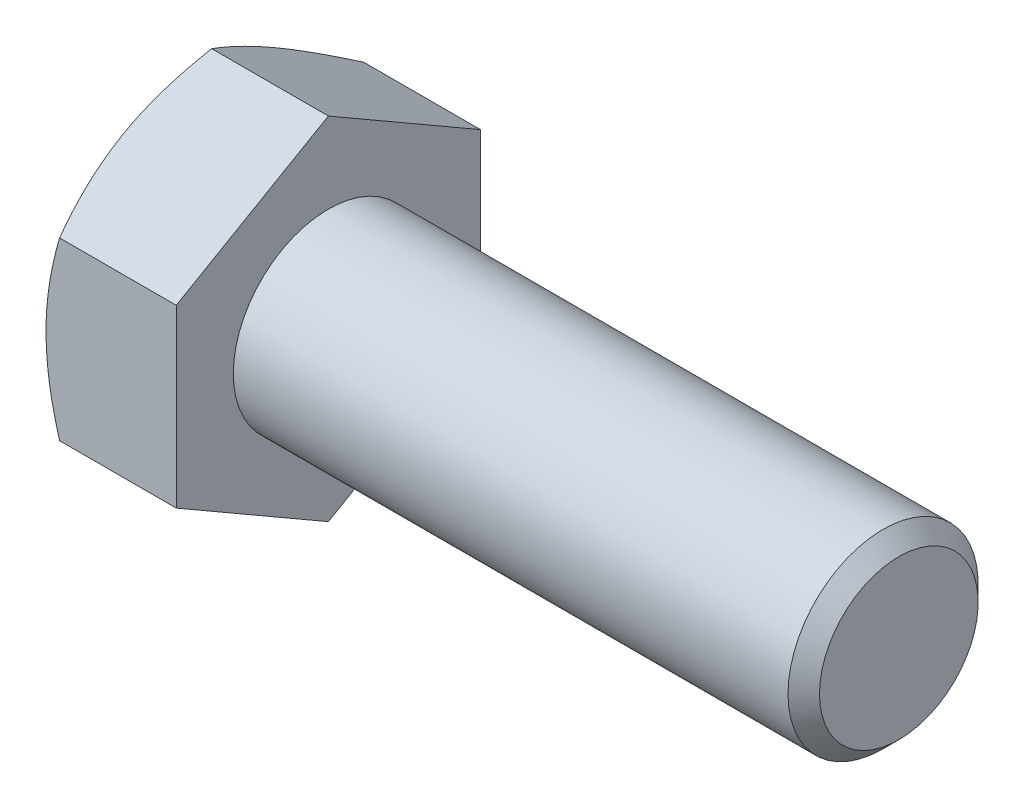
ISO-10303-21;
HEADER;
FILE_DESCRIPTION(('STEP AP214'),'2;1');
FILE_NAME('part.step','',(''),(''),'','','');
FILE_SCHEMA(('AUTOMOTIVE_DESIGN { 1 0 10303 214 1 1 1 1 }'));
ENDSEC;
DATA;
#1=APPLICATION_CONTEXT('core data for automotive mechanical design processes');
#2=APPLICATION_PROTOCOL_DEFINITION('international standard','automotive_design',2000,#1);
#3=PRODUCT_CONTEXT('',#1,'mechanical');
#4=PRODUCT('Part','Part','',(#3));
#5=PRODUCT_RELATED_PRODUCT_CATEGORY('part','',(#4));
#6=PRODUCT_DEFINITION_FORMATION('','',#4);
#7=PRODUCT_DEFINITION_CONTEXT('part definition',#1,'design');
#8=PRODUCT_DEFINITION('design','',#6,#7);
#9=PRODUCT_DEFINITION_SHAPE('','',#8);
#10=(LENGTH_UNIT() NAMED_UNIT(*) SI_UNIT(.MILLI.,.METRE.));
#11=(NAMED_UNIT(*) PLANE_ANGLE_UNIT() SI_UNIT($,.RADIAN.));
#12=(NAMED_UNIT(*) SI_UNIT($,.STERADIAN.) SOLID_ANGLE_UNIT());
#13=UNCERTAINTY_MEASURE_WITH_UNIT(LENGTH_MEASURE(1.E-05),#10,'distance_accuracy_value','');
#14=(GEOMETRIC_REPRESENTATION_CONTEXT(3) GLOBAL_UNCERTAINTY_ASSIGNED_CONTEXT((#13)) GLOBAL_UNIT_ASSIGNED_CONTEXT((#10,
#11,#12)) REPRESENTATION_CONTEXT('',''));
#15=CARTESIAN_POINT('',(0.,0.,0.));
#16=DIRECTION('',(0.,0.,1.));
#17=DIRECTION('',(1.,0.,0.));
#18=AXIS2_PLACEMENT_3D('',#15,#16,#17);
#19=CARTESIAN_POINT('',(0.,9.23760430703402,0.));
#20=DIRECTION('',(1.,0.,0.));
#21=DIRECTION('',(0.,0.,-1.));
#22=AXIS2_PLACEMENT_3D('',#19,#20,#21);
#23=PLANE('',#22);
#24=CARTESIAN_POINT('',(0.,0.,0.));
#25=DIRECTION('',(1.,0.,0.));
#26=DIRECTION('',(0.,0.,-1.));
#27=AXIS2_PLACEMENT_3D('',#24,#25,#26);
#28=CIRCLE('',#27,8.);
#29=CARTESIAN_POINT('',(0.,-6.92820323027551,-4.));
#30=VERTEX_POINT('',#29);
#31=CARTESIAN_POINT('',(0.,0.,-8.));
#32=VERTEX_POINT('',#31);
#33=EDGE_CURVE('E328',#30,#32,#28,.T.);
#34=ORIENTED_EDGE('',*,*,#33,.F.);
#35=CARTESIAN_POINT('',(0.,0.,0.));
#36=DIRECTION('',(1.,0.,0.));
#37=DIRECTION('',(0.,0.,-1.));
#38=AXIS2_PLACEMENT_3D('',#35,#36,#37);
#39=CIRCLE('',#38,8.);
#40=CARTESIAN_POINT('',(0.,-6.92820323027549,4.00000000000002));
#41=VERTEX_POINT('',#40);
#42=EDGE_CURVE('E327',#41,#30,#39,.T.);
#43=ORIENTED_EDGE('',*,*,#42,.F.);
#44=CARTESIAN_POINT('',(0.,0.,0.));
#45=DIRECTION('',(1.,0.,0.));
#46=DIRECTION('',(0.,0.,-1.));
#47=AXIS2_PLACEMENT_3D('',#44,#45,#46);
#48=CIRCLE('',#47,8.);
#49=CARTESIAN_POINT('',(0.,0.,8.));
#50=VERTEX_POINT('',#49);
#51=EDGE_CURVE('E89',#50,#41,#48,.T.);
#52=ORIENTED_EDGE('',*,*,#51,.F.);
#53=CARTESIAN_POINT('',(0.,0.,0.));
#54=DIRECTION('',(1.,0.,0.));
#55=DIRECTION('',(0.,0.,-1.));
#56=AXIS2_PLACEMENT_3D('',#53,#54,#55);
#57=CIRCLE('',#56,8.);
#58=CARTESIAN_POINT('',(0.,6.92820323027551,4.00000000000001));
#59=VERTEX_POINT('',#58);
#60=EDGE_CURVE('E87',#59,#50,#57,.T.);
#61=ORIENTED_EDGE('',*,*,#60,.F.);
#62=CARTESIAN_POINT('',(0.,0.,0.));
#63=DIRECTION('',(1.,0.,0.));
#64=DIRECTION('',(0.,0.,-1.));
#65=AXIS2_PLACEMENT_3D('',#62,#63,#64);
#66=CIRCLE('',#65,8.);
#67=CARTESIAN_POINT('',(0.,6.9282032302755,-4.00000000000001));
#68=VERTEX_POINT('',#67);
#69=EDGE_CURVE('E20',#68,#59,#66,.T.);
#70=ORIENTED_EDGE('',*,*,#69,.F.);
#71=CARTESIAN_POINT('',(0.,0.,0.));
#72=DIRECTION('',(1.,0.,0.));
#73=DIRECTION('',(0.,0.,-1.));
#74=AXIS2_PLACEMENT_3D('',#71,#72,#73);
#75=CIRCLE('',#74,8.);
#76=EDGE_CURVE('E255',#32,#68,#75,.T.);
#77=ORIENTED_EDGE('',*,*,#76,.F.);
#78=EDGE_LOOP('',(#34,#43,#52,#61,#70,#77));
#79=FACE_BOUND('',#78,.T.);
#80=ADVANCED_FACE('F17',(#79),#23,.F.);
#81=CARTESIAN_POINT('',(0.718818366895226,0.,0.));
#82=DIRECTION('',(1.,0.,0.));
#83=DIRECTION('',(0.,0.,-1.));
#84=AXIS2_PLACEMENT_3D('',#81,#82,#83);
#85=CONICAL_SURFACE('',#84,9.24502993287623,1.0471975511966);
#86=CARTESIAN_POINT('',(0.714531179816328,9.23760430703402,0.));
#87=CARTESIAN_POINT('',(0.605971186568709,9.04962004336392,-0.325598295700037));
#88=CARTESIAN_POINT('',(0.506511279503226,8.86013033415724,-0.653804099557457));
#89=CARTESIAN_POINT('',(0.331115524151833,8.47948058269123,-1.31310880898505));
#90=CARTESIAN_POINT('',(0.255063354511368,8.2883338178385,-1.64418471741241));
#91=CARTESIAN_POINT('',(0.161684202183002,7.99980970900142,-2.14392313312675));
#92=CARTESIAN_POINT('',(0.133996332855683,7.90327053836403,-2.31113388159127));
#93=CARTESIAN_POINT('',(0.0860680538837099,7.70973002472826,-2.64635588453139));
#94=CARTESIAN_POINT('',(0.065827448221416,7.61272869396238,-2.81436711781971));
#95=CARTESIAN_POINT('',(0.0331493236756243,7.41790506415178,-3.15181154316665));
#96=CARTESIAN_POINT('',(0.0207514868123127,7.3200810883273,-3.32124763949303));
#97=CARTESIAN_POINT('',(0.0041596647501133,7.12424074860085,-3.6604530580708));
#98=CARTESIAN_POINT('',(-3.26957018926844E-05,7.02622435044303,-3.83022243965505));
#99=CARTESIAN_POINT('',(0.,6.9282032302755,-4.00000000000001));
#100=B_SPLINE_CURVE_WITH_KNOTS('',3,(#86,#87,#88,#89,#90,#91,#92,#93,#94,#95,#96,#97,#98,#99),
.UNSPECIFIED.,.F.,.F.,(4,2,2,2,2,2,4),(0.,1.17445865342509,2.34298309186419,2.92801198525018,
3.51302547912926,4.10097577386237,4.68904247546297),.UNSPECIFIED.);
#101=CARTESIAN_POINT('',(0.714531179816327,9.23760430703402,0.));
#102=VERTEX_POINT('',#101);
#103=EDGE_CURVE('E99',#102,#68,#100,.T.);
#104=ORIENTED_EDGE('',*,*,#103,.T.);
#105=ORIENTED_EDGE('',*,*,#69,.T.);
#106=CARTESIAN_POINT('',(0.,6.92820323027551,4.00000000000001));
#107=CARTESIAN_POINT('',(-3.26957018920054E-05,7.02622435044303,3.83022243965505));
#108=CARTESIAN_POINT('',(0.00415966475011395,7.12424074860085,3.6604530580708));
#109=CARTESIAN_POINT('',(0.0207514868123136,7.32008108832731,3.32124763949303));
#110=CARTESIAN_POINT('',(0.0331493236756254,7.41790506415178,3.15181154316665));
#111=CARTESIAN_POINT('',(0.0658274482214168,7.61272869396238,2.81436711781971));
#112=CARTESIAN_POINT('',(0.0860680538837103,7.70973002472827,2.64635588453139));
#113=CARTESIAN_POINT('',(0.133996332855684,7.90327053836403,2.31113388159127));
#114=CARTESIAN_POINT('',(0.161684202183004,7.99980970900142,2.14392313312675));
#115=CARTESIAN_POINT('',(0.255063354511371,8.2883338178385,1.64418471741241));
#116=CARTESIAN_POINT('',(0.331115524151834,8.47948058269123,1.31310880898505));
#117=CARTESIAN_POINT('',(0.506511279503226,8.86013033415724,0.653804099557457));
#118=CARTESIAN_POINT('',(0.605971186568708,9.04962004336392,0.325598295700037));
#119=CARTESIAN_POINT('',(0.714531179816327,9.23760430703402,0.));
#120=B_SPLINE_CURVE_WITH_KNOTS('',3,(#106,#107,#108,#109,#110,#111,#112,#113,#114,#115,#116,
#117,#118,#119),.UNSPECIFIED.,.F.,.F.,(4,2,2,2,2,2,4),(0.,0.588066701600602,1.17601699633371,
1.76103049021279,2.34605938359878,3.51458382203788,4.68904247546297),.UNSPECIFIED.);
#121=EDGE_CURVE('E97',#59,#102,#120,.T.);
#122=ORIENTED_EDGE('',*,*,#121,.T.);
#123=EDGE_LOOP('',(#104,#105,#122));
#124=FACE_BOUND('',#123,.T.);
#125=ADVANCED_FACE('F95',(#124),#85,.T.);
#126=CARTESIAN_POINT('',(0.718818366895219,0.,0.));
#127=DIRECTION('',(1.,0.,0.));
#128=DIRECTION('',(0.,0.,-1.));
#129=AXIS2_PLACEMENT_3D('',#126,#127,#128);
#130=CONICAL_SURFACE('',#129,9.24502993287621,1.0471975511966);
#131=CARTESIAN_POINT('',(0.714531179816321,4.618802153517,8.));
#132=CARTESIAN_POINT('',(0.605971186568703,4.8067864171871,7.67440170429996));
#133=CARTESIAN_POINT('',(0.506511279503222,4.99627612639378,7.34619590044255));
#134=CARTESIAN_POINT('',(0.331115524151831,5.37692587785979,6.68689119101496));
#135=CARTESIAN_POINT('',(0.255063354511368,5.56807264271252,6.3558152825876));
#136=CARTESIAN_POINT('',(0.161684202183002,5.85659675154959,5.85607686687326));
#137=CARTESIAN_POINT('',(0.133996332855682,5.95313592218698,5.68886611840874));
#138=CARTESIAN_POINT('',(0.0860680538837097,6.14667643582275,5.35364411546862));
#139=CARTESIAN_POINT('',(0.0658274482214168,6.24367776658864,5.18563288218031));
#140=CARTESIAN_POINT('',(0.0331493236756258,6.43850139639923,4.84818845683336));
#141=CARTESIAN_POINT('',(0.0207514868123138,6.53632537222371,4.67875236050699));
#142=CARTESIAN_POINT('',(0.00415966475011389,6.73216571195016,4.33954694192922));
#143=CARTESIAN_POINT('',(-3.26957018923342E-05,6.83018211010798,4.16977756034497));
#144=CARTESIAN_POINT('',(0.,6.92820323027551,4.00000000000001));
#145=B_SPLINE_CURVE_WITH_KNOTS('',3,(#131,#132,#133,#134,#135,#136,#137,#138,#139,#140,#141,
#142,#143,#144),.UNSPECIFIED.,.F.,.F.,(4,2,2,2,2,2,4),(0.,1.17445865342508,2.34298309186418,
2.92801198525016,3.51302547912924,4.10097577386235,4.68904247546295),.UNSPECIFIED.);
#146=CARTESIAN_POINT('',(0.714531179816321,4.618802153517,8.));
#147=VERTEX_POINT('',#146);
#148=EDGE_CURVE('E102',#147,#59,#145,.T.);
#149=ORIENTED_EDGE('',*,*,#148,.T.);
#150=ORIENTED_EDGE('',*,*,#60,.T.);
#151=CARTESIAN_POINT('',(0.,0.,8.));
#152=CARTESIAN_POINT('',(-3.26957018927461E-05,0.196042240335043,8.));
#153=CARTESIAN_POINT('',(0.00415966475011312,0.392075036650689,8.));
#154=CARTESIAN_POINT('',(0.0207514868123118,0.783755716103597,8.));
#155=CARTESIAN_POINT('',(0.0331493236756227,0.979403667752545,8.));
#156=CARTESIAN_POINT('',(0.065827448221414,1.36905092737374,8.));
#157=CARTESIAN_POINT('',(0.0860680538837081,1.56305358890551,8.));
#158=CARTESIAN_POINT('',(0.133996332855681,1.95013461617705,8.));
#159=CARTESIAN_POINT('',(0.161684202183001,2.14321295745183,8.));
#160=CARTESIAN_POINT('',(0.255063354511366,2.72026117512596,8.));
#161=CARTESIAN_POINT('',(0.331115524151829,3.10255470483143,8.));
#162=CARTESIAN_POINT('',(0.506511279503222,3.86385420776345,8.));
#163=CARTESIAN_POINT('',(0.605971186568704,4.24283362617681,8.));
#164=CARTESIAN_POINT('',(0.714531179816321,4.618802153517,8.));
#165=B_SPLINE_CURVE_WITH_KNOTS('',3,(#151,#152,#153,#154,#155,#156,#157,#158,#159,#160,#161,
#162,#163,#164),.UNSPECIFIED.,.F.,.F.,(4,2,2,2,2,2,4),(0.,0.5880667016006,1.17601699633371,
1.76103049021279,2.34605938359877,3.51458382203787,4.68904247546295),.UNSPECIFIED.);
#166=EDGE_CURVE('E105',#50,#147,#165,.T.);
#167=ORIENTED_EDGE('',*,*,#166,.T.);
#168=EDGE_LOOP('',(#149,#150,#167));
#169=FACE_BOUND('',#168,.T.);
#170=ADVANCED_FACE('F103',(#169),#130,.T.);
#171=CARTESIAN_POINT('',(0.718818366895213,0.,0.));
#172=DIRECTION('',(1.,0.,0.));
#173=DIRECTION('',(0.,0.,-1.));
#174=AXIS2_PLACEMENT_3D('',#171,#172,#173);
#175=CONICAL_SURFACE('',#174,9.2450299328762,1.0471975511966);
#176=ORIENTED_EDGE('',*,*,#51,.T.);
#177=CARTESIAN_POINT('',(0.,-6.92820323027549,4.00000000000001));
#178=CARTESIAN_POINT('',(-3.26957018978315E-05,-6.83018211010797,4.16977756034497));
#179=CARTESIAN_POINT('',(0.00415966475010853,-6.73216571195015,4.33954694192922));
#180=CARTESIAN_POINT('',(0.0207514868123083,-6.53632537222369,4.67875236050699));
#181=CARTESIAN_POINT('',(0.0331493236756198,-6.43850139639922,4.84818845683337));
#182=CARTESIAN_POINT('',(0.0658274482214104,-6.24367776658862,5.18563288218031));
#183=CARTESIAN_POINT('',(0.0860680538837033,-6.14667643582273,5.35364411546862));
#184=CARTESIAN_POINT('',(0.133996332855676,-5.95313592218697,5.68886611840875));
#185=CARTESIAN_POINT('',(0.161684202182996,-5.85659675154958,5.85607686687327));
#186=CARTESIAN_POINT('',(0.255063354511363,-5.56807264271251,6.3558152825876));
#187=CARTESIAN_POINT('',(0.331115524151825,-5.37692587785977,6.68689119101496));
#188=CARTESIAN_POINT('',(0.506511279503216,-4.99627612639376,7.34619590044255));
#189=CARTESIAN_POINT('',(0.605971186568697,-4.80678641718708,7.67440170429997));
#190=CARTESIAN_POINT('',(0.714531179816316,-4.61880215351698,8.));
#191=B_SPLINE_CURVE_WITH_KNOTS('',3,(#177,#178,#179,#180,#181,#182,#183,#184,#185,#186,#187,
#188,#189,#190),.UNSPECIFIED.,.F.,.F.,(4,2,2,2,2,2,4),(0.,0.5880667016006,1.1760169963337,
1.76103049021279,2.34605938359877,3.51458382203787,4.68904247546295),.UNSPECIFIED.);
#192=CARTESIAN_POINT('',(0.714531179816316,-4.61880215351698,8.));
#193=VERTEX_POINT('',#192);
#194=EDGE_CURVE('E174',#41,#193,#191,.T.);
#195=ORIENTED_EDGE('',*,*,#194,.T.);
#196=CARTESIAN_POINT('',(0.714531179816316,-4.61880215351698,8.));
#197=CARTESIAN_POINT('',(0.605971186568698,-4.24283362617679,8.));
#198=CARTESIAN_POINT('',(0.506511279503216,-3.86385420776343,8.));
#199=CARTESIAN_POINT('',(0.331115524151826,-3.10255470483142,8.));
#200=CARTESIAN_POINT('',(0.255063354511365,-2.72026117512595,8.));
#201=CARTESIAN_POINT('',(0.161684202182999,-2.14321295745182,8.));
#202=CARTESIAN_POINT('',(0.13399633285568,-1.95013461617704,8.));
#203=CARTESIAN_POINT('',(0.0860680538837073,-1.56305358890551,8.));
#204=CARTESIAN_POINT('',(0.0658274482214138,-1.36905092737373,8.));
#205=CARTESIAN_POINT('',(0.0331493236756226,-0.979403667752541,8.));
#206=CARTESIAN_POINT('',(0.020751486812311,-0.783755716103593,8.));
#207=CARTESIAN_POINT('',(0.0041596647501118,-0.392075036650687,8.));
#208=CARTESIAN_POINT('',(-3.26957018940725E-05,-0.196042240335043,8.));
#209=CARTESIAN_POINT('',(0.,0.,8.));
#210=B_SPLINE_CURVE_WITH_KNOTS('',3,(#196,#197,#198,#199,#200,#201,#202,#203,#204,#205,#206,
#207,#208,#209),.UNSPECIFIED.,.F.,.F.,(4,2,2,2,2,2,4),(0.,1.17445865342508,2.34298309186417,
2.92801198525015,3.51302547912923,4.10097577386234,4.68904247546293),.UNSPECIFIED.);
#211=EDGE_CURVE('E148',#193,#50,#210,.T.);
#212=ORIENTED_EDGE('',*,*,#211,.T.);
#213=EDGE_LOOP('',(#176,#195,#212));
#214=FACE_BOUND('',#213,.T.);
#215=ADVANCED_FACE('F139',(#214),#175,.T.);
#216=CARTESIAN_POINT('',(0.718818366895222,0.,0.));
#217=DIRECTION('',(1.,0.,0.));
#218=DIRECTION('',(0.,0.,-1.));
#219=AXIS2_PLACEMENT_3D('',#216,#217,#218);
#220=CONICAL_SURFACE('',#219,9.24502993287622,1.0471975511966);
#221=ORIENTED_EDGE('',*,*,#42,.T.);
#222=CARTESIAN_POINT('',(0.,-6.92820323027551,-4.));
#223=CARTESIAN_POINT('',(-3.26957018913751E-05,-7.02622435044303,-3.83022243965504));
#224=CARTESIAN_POINT('',(0.00415966475011472,-7.12424074860086,-3.66045305807079));
#225=CARTESIAN_POINT('',(0.0207514868123143,-7.32008108832731,-3.32124763949302));
#226=CARTESIAN_POINT('',(0.0331493236756259,-7.41790506415179,-3.15181154316664));
#227=CARTESIAN_POINT('',(0.0658274482214166,-7.61272869396238,-2.8143671178197));
#228=CARTESIAN_POINT('',(0.0860680538837096,-7.70973002472827,-2.64635588453138));
#229=CARTESIAN_POINT('',(0.133996332855682,-7.90327053836404,-2.31113388159126));
#230=CARTESIAN_POINT('',(0.161684202183003,-7.99980970900143,-2.14392313312674));
#231=CARTESIAN_POINT('',(0.25506335451137,-8.28833381783849,-1.6441847174124));
#232=CARTESIAN_POINT('',(0.331115524151832,-8.47948058269123,-1.31310880898504));
#233=CARTESIAN_POINT('',(0.506511279503222,-8.86013033415724,-0.653804099557453));
#234=CARTESIAN_POINT('',(0.605971186568703,-9.04962004336391,-0.325598295700034));
#235=CARTESIAN_POINT('',(0.714531179816323,-9.23760430703401,0.));
#236=B_SPLINE_CURVE_WITH_KNOTS('',3,(#222,#223,#224,#225,#226,#227,#228,#229,#230,#231,#232,
#233,#234,#235),.UNSPECIFIED.,.F.,.F.,(4,2,2,2,2,2,4),(0.,0.5880667016006,1.17601699633371,
1.76103049021279,2.34605938359877,3.51458382203787,4.68904247546295),.UNSPECIFIED.);
#237=CARTESIAN_POINT('',(0.714531179816323,-9.23760430703401,0.));
#238=VERTEX_POINT('',#237);
#239=EDGE_CURVE('E302',#30,#238,#236,.T.);
#240=ORIENTED_EDGE('',*,*,#239,.T.);
#241=CARTESIAN_POINT('',(0.714531179816323,-9.23760430703401,0.));
#242=CARTESIAN_POINT('',(0.605971186568704,-9.04962004336391,0.325598295700038));
#243=CARTESIAN_POINT('',(0.506511279503222,-8.86013033415723,0.653804099557459));
#244=CARTESIAN_POINT('',(0.331115524151828,-8.47948058269122,1.31310880898505));
#245=CARTESIAN_POINT('',(0.255063354511364,-8.28833381783849,1.64418471741241));
#246=CARTESIAN_POINT('',(0.161684202182998,-7.99980970900141,2.14392313312675));
#247=CARTESIAN_POINT('',(0.133996332855678,-7.90327053836402,2.31113388159127));
#248=CARTESIAN_POINT('',(0.0860680538837045,-7.70973002472825,2.6463558845314));
#249=CARTESIAN_POINT('',(0.065827448221411,-7.61272869396236,2.81436711781971));
#250=CARTESIAN_POINT('',(0.0331493236756197,-7.41790506415177,3.15181154316665));
#251=CARTESIAN_POINT('',(0.0207514868123081,-7.32008108832729,3.32124763949303));
#252=CARTESIAN_POINT('',(0.0041596647501085,-7.12424074860084,3.6604530580708));
#253=CARTESIAN_POINT('',(-3.26957018976468E-05,-7.02622435044301,3.83022243965505));
#254=CARTESIAN_POINT('',(0.,-6.92820323027549,4.00000000000001));
#255=B_SPLINE_CURVE_WITH_KNOTS('',3,(#241,#242,#243,#244,#245,#246,#247,#248,#249,#250,#251,
#252,#253,#254),.UNSPECIFIED.,.F.,.F.,(4,2,2,2,2,2,4),(0.,1.17445865342509,2.34298309186419,
2.92801198525018,3.51302547912926,4.10097577386237,4.68904247546298),.UNSPECIFIED.);
#256=EDGE_CURVE('E169',#238,#41,#255,.T.);
#257=ORIENTED_EDGE('',*,*,#256,.T.);
#258=EDGE_LOOP('',(#221,#240,#257));
#259=FACE_BOUND('',#258,.T.);
#260=ADVANCED_FACE('F318',(#259),#220,.T.);
#261=CARTESIAN_POINT('',(0.718818366895235,0.,0.));
#262=DIRECTION('',(1.,0.,0.));
#263=DIRECTION('',(0.,0.,-1.));
#264=AXIS2_PLACEMENT_3D('',#261,#262,#263);
#265=CONICAL_SURFACE('',#264,9.24502993287624,1.0471975511966);
#266=ORIENTED_EDGE('',*,*,#33,.T.);
#267=CARTESIAN_POINT('',(0.,0.,-8.));
#268=CARTESIAN_POINT('',(-3.26957018933915E-05,-0.196042240335049,-8.));
#269=CARTESIAN_POINT('',(0.00415966475011285,-0.3920750366507,-8.));
#270=CARTESIAN_POINT('',(0.0207514868123133,-0.783755716103619,-8.));
#271=CARTESIAN_POINT('',(0.0331493236756256,-0.979403667752572,-8.));
#272=CARTESIAN_POINT('',(0.0658274482214185,-1.36905092737377,-8.));
#273=CARTESIAN_POINT('',(0.0860680538837129,-1.56305358890556,-8.));
#274=CARTESIAN_POINT('',(0.133996332855688,-1.9501346161771,-8.));
#275=CARTESIAN_POINT('',(0.161684202183009,-2.14321295745189,-8.));
#276=CARTESIAN_POINT('',(0.255063354511381,-2.72026117512604,-8.));
#277=CARTESIAN_POINT('',(0.331115524151848,-3.10255470483152,-8.));
#278=CARTESIAN_POINT('',(0.506511279503249,-3.86385420776355,-8.));
#279=CARTESIAN_POINT('',(0.605971186568735,-4.24283362617692,-8.));
#280=CARTESIAN_POINT('',(0.714531179816358,-4.61880215351713,-8.));
#281=B_SPLINE_CURVE_WITH_KNOTS('',3,(#267,#268,#269,#270,#271,#272,#273,#274,#275,#276,#277,
#278,#279,#280),.UNSPECIFIED.,.F.,.F.,(4,2,2,2,2,2,4),(0.,0.588066701600617,1.17601699633374,
1.76103049021284,2.34605938359884,3.51458382203797,4.68904247546308),.UNSPECIFIED.);
#282=CARTESIAN_POINT('',(0.714531179816318,-4.61880215351711,-7.99999999999993));
#283=VERTEX_POINT('',#282);
#284=EDGE_CURVE('E233',#32,#283,#281,.T.);
#285=ORIENTED_EDGE('',*,*,#284,.T.);
#286=CARTESIAN_POINT('',(0.714531179816278,-4.61880215351709,-7.99999999999986));
#287=CARTESIAN_POINT('',(0.605971186568667,-4.80678641718718,-7.67440170429984));
#288=CARTESIAN_POINT('',(0.506511279503191,-4.99627612639386,-7.34619590044243));
#289=CARTESIAN_POINT('',(0.331115524151809,-5.37692587785985,-6.68689119101486));
#290=CARTESIAN_POINT('',(0.255063354511351,-5.56807264271258,-6.35581528258751));
#291=CARTESIAN_POINT('',(0.161684202182991,-5.85659675154964,-5.85607686687319));
#292=CARTESIAN_POINT('',(0.133996332855674,-5.95313592218703,-5.68886611840868));
#293=CARTESIAN_POINT('',(0.0860680538837046,-6.14667643582278,-5.35364411546856));
#294=CARTESIAN_POINT('',(0.0658274482214122,-6.24367776658867,-5.18563288218026));
#295=CARTESIAN_POINT('',(0.033149323675623,-6.43850139639926,-4.84818845683333));
#296=CARTESIAN_POINT('',(0.0207514868123123,-6.53632537222373,-4.67875236050695));
#297=CARTESIAN_POINT('',(0.00415966475011397,-6.73216571195018,-4.3395469419292));
#298=CARTESIAN_POINT('',(-3.26957018917808E-05,-6.830182110108,-4.16977756034495));
#299=CARTESIAN_POINT('',(0.,-6.92820323027551,-4.));
#300=B_SPLINE_CURVE_WITH_KNOTS('',3,(#286,#287,#288,#289,#290,#291,#292,#293,#294,#295,#296,
#297,#298,#299),.UNSPECIFIED.,.F.,.F.,(4,2,2,2,2,2,4),(0.,1.17445865342504,2.3429830918641,
2.92801198525006,3.51302547912912,4.10097577386221,4.68904247546279),.UNSPECIFIED.);
#301=EDGE_CURVE('E301',#283,#30,#300,.T.);
#302=ORIENTED_EDGE('',*,*,#301,.T.);
#303=EDGE_LOOP('',(#266,#285,#302));
#304=FACE_BOUND('',#303,.T.);
#305=ADVANCED_FACE('F247',(#304),#265,.T.);
#306=CARTESIAN_POINT('',(0.718818366895218,0.,0.));
#307=DIRECTION('',(1.,0.,0.));
#308=DIRECTION('',(0.,0.,-1.));
#309=AXIS2_PLACEMENT_3D('',#306,#307,#308);
#310=CONICAL_SURFACE('',#309,9.24502993287621,1.0471975511966);
#311=CARTESIAN_POINT('',(0.71453117981632,4.618802153517,-8.));
#312=CARTESIAN_POINT('',(0.605971186568703,4.2428336261768,-8.));
#313=CARTESIAN_POINT('',(0.506511279503221,3.86385420776344,-8.));
#314=CARTESIAN_POINT('',(0.331115524151829,3.10255470483143,-8.));
#315=CARTESIAN_POINT('',(0.255063354511366,2.72026117512596,-8.));
#316=CARTESIAN_POINT('',(0.161684202183,2.14321295745182,-8.));
#317=CARTESIAN_POINT('',(0.133996332855681,1.95013461617704,-8.));
#318=CARTESIAN_POINT('',(0.0860680538837083,1.56305358890551,-8.));
#319=CARTESIAN_POINT('',(0.0658274482214147,1.36905092737373,-8.));
#320=CARTESIAN_POINT('',(0.0331493236756234,0.979403667752543,-8.));
#321=CARTESIAN_POINT('',(0.0207514868123118,0.783755716103595,-8.));
#322=CARTESIAN_POINT('',(0.00415966475011252,0.392075036650688,-8.));
#323=CARTESIAN_POINT('',(-3.26957018933045E-05,0.196042240335043,-8.));
#324=CARTESIAN_POINT('',(0.,0.,-8.));
#325=B_SPLINE_CURVE_WITH_KNOTS('',3,(#311,#312,#313,#314,#315,#316,#317,#318,#319,#320,#321,
#322,#323,#324),.UNSPECIFIED.,.F.,.F.,(4,2,2,2,2,2,4),(0.,1.17445865342508,2.34298309186418,
2.92801198525016,3.51302547912924,4.10097577386235,4.68904247546295),.UNSPECIFIED.);
#326=CARTESIAN_POINT('',(0.71453117981632,4.618802153517,-8.));
#327=VERTEX_POINT('',#326);
#328=EDGE_CURVE('E225',#327,#32,#325,.T.);
#329=ORIENTED_EDGE('',*,*,#328,.T.);
#330=ORIENTED_EDGE('',*,*,#76,.T.);
#331=CARTESIAN_POINT('',(0.,6.9282032302755,-4.00000000000001));
#332=CARTESIAN_POINT('',(-3.26957018923798E-05,6.83018211010798,-4.16977756034497));
#333=CARTESIAN_POINT('',(0.0041596647501136,6.73216571195016,-4.33954694192922));
#334=CARTESIAN_POINT('',(0.0207514868123125,6.5363253722237,-4.67875236050699));
#335=CARTESIAN_POINT('',(0.0331493236756235,6.43850139639923,-4.84818845683337));
#336=CARTESIAN_POINT('',(0.0658274482214144,6.24367776658863,-5.18563288218031));
#337=CARTESIAN_POINT('',(0.0860680538837081,6.14667643582275,-5.35364411546862));
#338=CARTESIAN_POINT('',(0.133996332855681,5.95313592218698,-5.68886611840874));
#339=CARTESIAN_POINT('',(0.161684202183001,5.85659675154959,-5.85607686687326));
#340=CARTESIAN_POINT('',(0.255063354511367,5.56807264271252,-6.3558152825876));
#341=CARTESIAN_POINT('',(0.33111552415183,5.37692587785978,-6.68689119101496));
#342=CARTESIAN_POINT('',(0.506511279503221,4.99627612639378,-7.34619590044255));
#343=CARTESIAN_POINT('',(0.605971186568702,4.8067864171871,-7.67440170429997));
#344=CARTESIAN_POINT('',(0.71453117981632,4.618802153517,-8.));
#345=B_SPLINE_CURVE_WITH_KNOTS('',3,(#331,#332,#333,#334,#335,#336,#337,#338,#339,#340,#341,
#342,#343,#344),.UNSPECIFIED.,.F.,.F.,(4,2,2,2,2,2,4),(0.,0.588066701600601,1.17601699633371,
1.76103049021279,2.34605938359877,3.51458382203787,4.68904247546295),.UNSPECIFIED.);
#346=EDGE_CURVE('E115',#68,#327,#345,.T.);
#347=ORIENTED_EDGE('',*,*,#346,.T.);
#348=EDGE_LOOP('',(#329,#330,#347));
#349=FACE_BOUND('',#348,.T.);
#350=ADVANCED_FACE('F242',(#349),#310,.T.);
#351=CARTESIAN_POINT('',(36.85,0.,0.));
#352=DIRECTION('',(-1.,0.,0.));
#353=DIRECTION('',(0.,0.,1.));
#354=AXIS2_PLACEMENT_3D('',#351,#352,#353);
#355=PLANE('',#354);
#356=CARTESIAN_POINT('',(36.8499999999585,0.,0.));
#357=DIRECTION('',(-1.,0.,0.));
#358=DIRECTION('',(0.,0.,1.));
#359=AXIS2_PLACEMENT_3D('',#356,#357,#358);
#360=CIRCLE('',#359,4.17199999998275);
#361=CARTESIAN_POINT('',(36.8499999999585,0.,4.17199999998275));
#362=VERTEX_POINT('',#361);
#363=EDGE_CURVE('E196',#362,#362,#360,.T.);
#364=ORIENTED_EDGE('',*,*,#363,.F.);
#365=EDGE_LOOP('',(#364));
#366=FACE_BOUND('',#365,.T.);
#367=ADVANCED_FACE('F246',(#366),#355,.F.);
#368=CARTESIAN_POINT('',(6.85,4.618802153517,-8.));
#369=DIRECTION('',(0.,-0.866025403784438,0.500000000000001));
#370=DIRECTION('',(0.,-0.500000000000001,-0.866025403784438));
#371=AXIS2_PLACEMENT_3D('',#368,#369,#370);
#372=PLANE('',#371);
#373=DIRECTION('',(1.,0.,0.));
#374=VECTOR('',#373,1.);
#375=CARTESIAN_POINT('',(6.85,9.23760430703402,0.));
#376=LINE('',#375,#374);
#377=CARTESIAN_POINT('',(6.85,9.23760430703402,0.));
#378=VERTEX_POINT('',#377);
#379=EDGE_CURVE('E108',#102,#378,#376,.T.);
#380=ORIENTED_EDGE('',*,*,#379,.T.);
#381=DIRECTION('',(0.,0.500000000000001,0.866025403784438));
#382=VECTOR('',#381,1.);
#383=CARTESIAN_POINT('',(6.85,4.618802153517,-8.));
#384=LINE('',#383,#382);
#385=CARTESIAN_POINT('',(6.85,4.618802153517,-8.));
#386=VERTEX_POINT('',#385);
#387=EDGE_CURVE('E192',#386,#378,#384,.T.);
#388=ORIENTED_EDGE('',*,*,#387,.F.);
#389=DIRECTION('',(1.,0.,0.));
#390=VECTOR('',#389,1.);
#391=CARTESIAN_POINT('',(6.85,4.618802153517,-8.));
#392=LINE('',#391,#390);
#393=EDGE_CURVE('E232',#386,#327,#392,.F.);
#394=ORIENTED_EDGE('',*,*,#393,.T.);
#395=ORIENTED_EDGE('',*,*,#346,.F.);
#396=ORIENTED_EDGE('',*,*,#103,.F.);
#397=EDGE_LOOP('',(#380,#388,#394,#395,#396));
#398=FACE_BOUND('',#397,.T.);
#399=ADVANCED_FACE('F257',(#398),#372,.F.);
#400=CARTESIAN_POINT('',(6.85,9.23760430703402,0.));
#401=DIRECTION('',(0.,-0.866025403784438,-0.500000000000001));
#402=DIRECTION('',(0.,0.500000000000001,-0.866025403784438));
#403=AXIS2_PLACEMENT_3D('',#400,#401,#402);
#404=PLANE('',#403);
#405=DIRECTION('',(-1.,0.,0.));
#406=VECTOR('',#405,1.);
#407=CARTESIAN_POINT('',(6.85,4.618802153517,8.));
#408=LINE('',#407,#406);
#409=CARTESIAN_POINT('',(6.85,4.618802153517,8.));
#410=VERTEX_POINT('',#409);
#411=EDGE_CURVE('E147',#147,#410,#408,.F.);
#412=ORIENTED_EDGE('',*,*,#411,.T.);
#413=DIRECTION('',(0.,-0.500000000000001,0.866025403784438));
#414=VECTOR('',#413,1.);
#415=CARTESIAN_POINT('',(6.85,9.23760430703402,0.));
#416=LINE('',#415,#414);
#417=EDGE_CURVE('E195',#378,#410,#416,.T.);
#418=ORIENTED_EDGE('',*,*,#417,.F.);
#419=ORIENTED_EDGE('',*,*,#379,.F.);
#420=ORIENTED_EDGE('',*,*,#121,.F.);
#421=ORIENTED_EDGE('',*,*,#148,.F.);
#422=EDGE_LOOP('',(#412,#418,#419,#420,#421));
#423=FACE_BOUND('',#422,.T.);
#424=ADVANCED_FACE('F111',(#423),#404,.F.);
#425=CARTESIAN_POINT('',(6.85,4.618802153517,8.));
#426=DIRECTION('',(0.,0.,-1.));
#427=DIRECTION('',(-1.,0.,0.));
#428=AXIS2_PLACEMENT_3D('',#425,#426,#427);
#429=PLANE('',#428);
#430=DIRECTION('',(1.,0.,0.));
#431=VECTOR('',#430,1.);
#432=CARTESIAN_POINT('',(6.85,-4.61880215351698,8.));
#433=LINE('',#432,#431);
#434=CARTESIAN_POINT('',(6.85,-4.61880215351698,8.));
#435=VERTEX_POINT('',#434);
#436=EDGE_CURVE('E178',#193,#435,#433,.T.);
#437=ORIENTED_EDGE('',*,*,#436,.T.);
#438=DIRECTION('',(0.,1.,0.));
#439=VECTOR('',#438,1.);
#440=CARTESIAN_POINT('',(6.85,9.23760430703402,8.));
#441=LINE('',#440,#439);
#442=EDGE_CURVE('E212',#410,#435,#441,.F.);
#443=ORIENTED_EDGE('',*,*,#442,.F.);
#444=ORIENTED_EDGE('',*,*,#411,.F.);
#445=ORIENTED_EDGE('',*,*,#166,.F.);
#446=ORIENTED_EDGE('',*,*,#211,.F.);
#447=EDGE_LOOP('',(#437,#443,#444,#445,#446));
#448=FACE_BOUND('',#447,.T.);
#449=ADVANCED_FACE('F153',(#448),#429,.F.);
#450=CARTESIAN_POINT('',(6.85,-9.23760430703402,0.));
#451=DIRECTION('',(0.,0.866025403784437,-0.500000000000002));
#452=DIRECTION('',(0.,0.500000000000002,0.866025403784437));
#453=AXIS2_PLACEMENT_3D('',#450,#451,#452);
#454=PLANE('',#453);
#455=DIRECTION('',(1.,0.,0.));
#456=VECTOR('',#455,1.);
#457=CARTESIAN_POINT('',(6.85,-9.23760430703401,0.));
#458=LINE('',#457,#456);
#459=CARTESIAN_POINT('',(6.85,-9.23760430703401,0.));
#460=VERTEX_POINT('',#459);
#461=EDGE_CURVE('E299',#238,#460,#458,.T.);
#462=ORIENTED_EDGE('',*,*,#461,.T.);
#463=DIRECTION('',(0.,-0.500000000000002,-0.866025403784438));
#464=VECTOR('',#463,1.);
#465=CARTESIAN_POINT('',(6.85,-4.61880215351698,8.));
#466=LINE('',#465,#464);
#467=EDGE_CURVE('E207',#435,#460,#466,.T.);
#468=ORIENTED_EDGE('',*,*,#467,.F.);
#469=ORIENTED_EDGE('',*,*,#436,.F.);
#470=ORIENTED_EDGE('',*,*,#194,.F.);
#471=ORIENTED_EDGE('',*,*,#256,.F.);
#472=EDGE_LOOP('',(#462,#468,#469,#470,#471));
#473=FACE_BOUND('',#472,.T.);
#474=ADVANCED_FACE('F157',(#473),#454,.F.);
#475=CARTESIAN_POINT('',(6.85,-4.61880215351701,-8.));
#476=DIRECTION('',(0.,0.866025403784439,0.5));
#477=DIRECTION('',(0.,-0.5,0.866025403784439));
#478=AXIS2_PLACEMENT_3D('',#475,#476,#477);
#479=PLANE('',#478);
#480=DIRECTION('',(1.,0.,0.));
#481=VECTOR('',#480,1.);
#482=CARTESIAN_POINT('',(6.85,-4.61880215351726,-8.));
#483=LINE('',#482,#481);
#484=CARTESIAN_POINT('',(6.85,-4.61880215351717,-8.));
#485=VERTEX_POINT('',#484);
#486=EDGE_CURVE('E35',#283,#485,#483,.T.);
#487=ORIENTED_EDGE('',*,*,#486,.T.);
#488=DIRECTION('',(0.,0.5,-0.866025403784439));
#489=VECTOR('',#488,1.);
#490=CARTESIAN_POINT('',(6.85,-9.23760430703401,0.));
#491=LINE('',#490,#489);
#492=EDGE_CURVE('E202',#460,#485,#491,.T.);
#493=ORIENTED_EDGE('',*,*,#492,.F.);
#494=ORIENTED_EDGE('',*,*,#461,.F.);
#495=ORIENTED_EDGE('',*,*,#239,.F.);
#496=ORIENTED_EDGE('',*,*,#301,.F.);
#497=EDGE_LOOP('',(#487,#493,#494,#495,#496));
#498=FACE_BOUND('',#497,.T.);
#499=ADVANCED_FACE('F163',(#498),#479,.F.);
#500=CARTESIAN_POINT('',(6.85,4.618802153517,-8.));
#501=DIRECTION('',(0.,0.,1.));
#502=DIRECTION('',(1.,0.,0.));
#503=AXIS2_PLACEMENT_3D('',#500,#501,#502);
#504=PLANE('',#503);
#505=ORIENTED_EDGE('',*,*,#393,.F.);
#506=DIRECTION('',(0.,1.,0.));
#507=VECTOR('',#506,1.);
#508=CARTESIAN_POINT('',(6.85,9.23760430703402,-8.));
#509=LINE('',#508,#507);
#510=EDGE_CURVE('E199',#485,#386,#509,.T.);
#511=ORIENTED_EDGE('',*,*,#510,.F.);
#512=ORIENTED_EDGE('',*,*,#486,.F.);
#513=ORIENTED_EDGE('',*,*,#284,.F.);
#514=ORIENTED_EDGE('',*,*,#328,.F.);
#515=EDGE_LOOP('',(#505,#511,#512,#513,#514));
#516=FACE_BOUND('',#515,.T.);
#517=ADVANCED_FACE('F239',(#516),#504,.F.);
#518=CARTESIAN_POINT('',(36.0220000000027,0.,0.));
#519=DIRECTION('',(-1.,0.,0.));
#520=DIRECTION('',(0.,0.,1.));
#521=AXIS2_PLACEMENT_3D('',#518,#519,#520);
#522=CONICAL_SURFACE('',#521,4.99999999993861,0.785398163397448);
#523=CARTESIAN_POINT('',(36.022,0.,0.));
#524=DIRECTION('',(-1.,0.,0.));
#525=DIRECTION('',(0.,0.,1.));
#526=AXIS2_PLACEMENT_3D('',#523,#524,#525);
#527=CIRCLE('',#526,5.);
#528=CARTESIAN_POINT('',(36.022,0.,5.));
#529=VERTEX_POINT('',#528);
#530=EDGE_CURVE('E26',#529,#529,#527,.T.);
#531=ORIENTED_EDGE('',*,*,#530,.F.);
#532=EDGE_LOOP('',(#531));
#533=FACE_BOUND('',#532,.T.);
#534=ORIENTED_EDGE('',*,*,#363,.T.);
#535=EDGE_LOOP('',(#534));
#536=FACE_BOUND('',#535,.T.);
#537=ADVANCED_FACE('F276',(#533,#536),#522,.T.);
#538=CARTESIAN_POINT('',(6.85,9.23760430703402,0.));
#539=DIRECTION('',(1.,0.,0.));
#540=DIRECTION('',(0.,0.,-1.));
#541=AXIS2_PLACEMENT_3D('',#538,#539,#540);
#542=PLANE('',#541);
#543=ORIENTED_EDGE('',*,*,#492,.T.);
#544=ORIENTED_EDGE('',*,*,#510,.T.);
#545=ORIENTED_EDGE('',*,*,#387,.T.);
#546=ORIENTED_EDGE('',*,*,#417,.T.);
#547=ORIENTED_EDGE('',*,*,#442,.T.);
#548=ORIENTED_EDGE('',*,*,#467,.T.);
#549=EDGE_LOOP('',(#543,#544,#545,#546,#547,#548));
#550=FACE_BOUND('',#549,.T.);
#551=CARTESIAN_POINT('',(6.85,0.,0.));
#552=DIRECTION('',(-1.,0.,0.));
#553=DIRECTION('',(0.,0.,1.));
#554=AXIS2_PLACEMENT_3D('',#551,#552,#553);
#555=CIRCLE('',#554,5.);
#556=CARTESIAN_POINT('',(6.85,0.,5.));
#557=VERTEX_POINT('',#556);
#558=EDGE_CURVE('E11',#557,#557,#555,.F.);
#559=ORIENTED_EDGE('',*,*,#558,.F.);
#560=EDGE_LOOP('',(#559));
#561=FACE_BOUND('',#560,.T.);
#562=ADVANCED_FACE('F270',(#550,#561),#542,.T.);
#563=CARTESIAN_POINT('',(0.,0.,0.));
#564=DIRECTION('',(-1.,0.,0.));
#565=DIRECTION('',(0.,0.,1.));
#566=AXIS2_PLACEMENT_3D('',#563,#564,#565);
#567=CYLINDRICAL_SURFACE('',#566,5.);
#568=ORIENTED_EDGE('',*,*,#558,.T.);
#569=EDGE_LOOP('',(#568));
#570=FACE_BOUND('',#569,.T.);
#571=ORIENTED_EDGE('',*,*,#530,.T.);
#572=EDGE_LOOP('',(#571));
#573=FACE_BOUND('',#572,.T.);
#574=ADVANCED_FACE('F268',(#570,#573),#567,.T.);
#575=CLOSED_SHELL('',(#80,#125,#170,#215,#260,#305,#350,#367,#399,#424,#449,#474,#499,#517,#537,
#562,#574));
#576=MANIFOLD_SOLID_BREP('B1',#575);
#577=ADVANCED_BREP_SHAPE_REPRESENTATION('',(#18,#576),#14);
#578=SHAPE_DEFINITION_REPRESENTATION(#9,#577);
ENDSEC;
END-ISO-10303-21;
